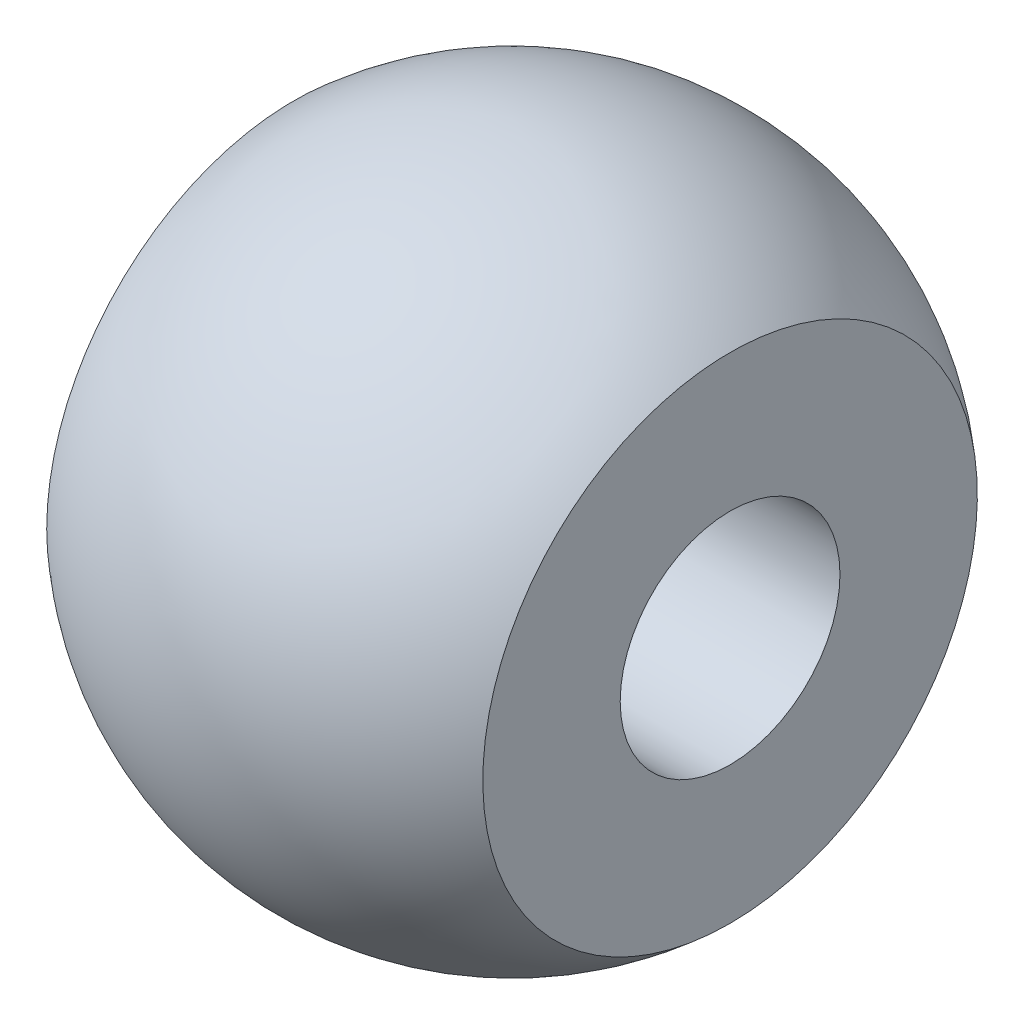
ISO-10303-21;
HEADER;
FILE_DESCRIPTION(('STEP AP214'),'2;1');
FILE_NAME('part.step','',(''),(''),'','','');
FILE_SCHEMA(('AUTOMOTIVE_DESIGN { 1 0 10303 214 1 1 1 1 }'));
ENDSEC;
DATA;
#1=APPLICATION_CONTEXT('core data for automotive mechanical design processes');
#2=APPLICATION_PROTOCOL_DEFINITION('international standard','automotive_design',2000,#1);
#3=PRODUCT_CONTEXT('',#1,'mechanical');
#4=PRODUCT('Part','Part','',(#3));
#5=PRODUCT_RELATED_PRODUCT_CATEGORY('part','',(#4));
#6=PRODUCT_DEFINITION_FORMATION('','',#4);
#7=PRODUCT_DEFINITION_CONTEXT('part definition',#1,'design');
#8=PRODUCT_DEFINITION('design','',#6,#7);
#9=PRODUCT_DEFINITION_SHAPE('','',#8);
#10=(LENGTH_UNIT() NAMED_UNIT(*) SI_UNIT(.MILLI.,.METRE.));
#11=(NAMED_UNIT(*) PLANE_ANGLE_UNIT() SI_UNIT($,.RADIAN.));
#12=(NAMED_UNIT(*) SI_UNIT($,.STERADIAN.) SOLID_ANGLE_UNIT());
#13=UNCERTAINTY_MEASURE_WITH_UNIT(LENGTH_MEASURE(1.E-05),#10,'distance_accuracy_value','');
#14=(GEOMETRIC_REPRESENTATION_CONTEXT(3) GLOBAL_UNCERTAINTY_ASSIGNED_CONTEXT((#13)) GLOBAL_UNIT_ASSIGNED_CONTEXT((#10,
#11,#12)) REPRESENTATION_CONTEXT('',''));
#15=CARTESIAN_POINT('',(0.,0.,0.));
#16=DIRECTION('',(0.,0.,1.));
#17=DIRECTION('',(1.,0.,0.));
#18=AXIS2_PLACEMENT_3D('',#15,#16,#17);
#19=CARTESIAN_POINT('',(-3.96862696659689,0.,0.));
#20=DIRECTION('',(-1.,0.,0.));
#21=DIRECTION('',(0.,0.,1.));
#22=AXIS2_PLACEMENT_3D('',#19,#20,#21);
#23=CONICAL_SURFACE('',#22,4.5,0.78539816339745);
#24=CARTESIAN_POINT('',(-1.4686269665969,0.,0.));
#25=DIRECTION('',(-1.,0.,0.));
#26=DIRECTION('',(0.,0.,1.));
#27=AXIS2_PLACEMENT_3D('',#24,#25,#26);
#28=CIRCLE('',#27,2.);
#29=CARTESIAN_POINT('',(-1.4686269665969,0.,2.));
#30=VERTEX_POINT('',#29);
#31=EDGE_CURVE('E48',#30,#30,#28,.T.);
#32=ORIENTED_EDGE('',*,*,#31,.F.);
#33=EDGE_LOOP('',(#32));
#34=FACE_BOUND('',#33,.T.);
#35=CARTESIAN_POINT('',(-3.96862696659689,0.,0.));
#36=DIRECTION('',(-1.,0.,0.));
#37=DIRECTION('',(0.,0.,1.));
#38=AXIS2_PLACEMENT_3D('',#35,#36,#37);
#39=CIRCLE('',#38,4.5);
#40=CARTESIAN_POINT('',(-3.96862696659689,-4.5,0.));
#41=VERTEX_POINT('',#40);
#42=EDGE_CURVE('E10',#41,#41,#39,.T.);
#43=ORIENTED_EDGE('',*,*,#42,.T.);
#44=EDGE_LOOP('',(#43));
#45=FACE_BOUND('',#44,.T.);
#46=ADVANCED_FACE('F34',(#34,#45),#23,.F.);
#47=CARTESIAN_POINT('',(0.,0.,0.));
#48=DIRECTION('',(-1.,0.,0.));
#49=DIRECTION('',(0.,-1.,0.));
#50=AXIS2_PLACEMENT_3D('',#47,#48,#49);
#51=SPHERICAL_SURFACE('',#50,6.);
#52=CARTESIAN_POINT('',(3.96862696659689,0.,0.));
#53=DIRECTION('',(-1.,0.,0.));
#54=DIRECTION('',(0.,0.,1.));
#55=AXIS2_PLACEMENT_3D('',#52,#53,#54);
#56=CIRCLE('',#55,4.5);
#57=CARTESIAN_POINT('',(3.96862696659689,-4.5,0.));
#58=VERTEX_POINT('',#57);
#59=EDGE_CURVE('E40',#58,#58,#56,.T.);
#60=CARTESIAN_POINT('',(3.96862696659689,-4.5,0.));
#61=CARTESIAN_POINT('',(3.90087156970494,-4.55975663481962,0.));
#62=CARTESIAN_POINT('',(3.83176471598761,-4.61798068485083,0.));
#63=CARTESIAN_POINT('',(3.69099319258735,-4.73124994921595,0.));
#64=CARTESIAN_POINT('',(3.61932852290442,-4.78629516354986,0.));
#65=CARTESIAN_POINT('',(3.47358646525808,-4.89309309039986,0.));
#66=CARTESIAN_POINT('',(3.39950907729467,-4.94484580291597,0.));
#67=CARTESIAN_POINT('',(3.24909300105526,-5.0449535145759,0.));
#68=CARTESIAN_POINT('',(3.17275431277925,-5.09330851371973,0.));
#69=CARTESIAN_POINT('',(3.01797129243332,-5.18652205302433,0.));
#70=CARTESIAN_POINT('',(2.93952696036339,-5.23138059318509,0.));
#71=CARTESIAN_POINT('',(2.78069270497835,-5.31750972666551,0.));
#72=CARTESIAN_POINT('',(2.70030278166326,-5.35878031998517,0.));
#73=CARTESIAN_POINT('',(2.5377413385661,-5.43764935813207,0.));
#74=CARTESIAN_POINT('',(2.45556981878404,-5.4752478029593,0.));
#75=CARTESIAN_POINT('',(2.28961281930654,-5.54669584283945,0.));
#76=CARTESIAN_POINT('',(2.2058273396111,-5.58054543789236,0.));
#77=CARTESIAN_POINT('',(2.03681334750818,-5.64442672242946,0.));
#78=CARTESIAN_POINT('',(1.95158483510071,-5.67445841191364,0.));
#79=CARTESIAN_POINT('',(1.77985864916938,-5.7306426189277,0.));
#80=CARTESIAN_POINT('',(1.69336097564551,-5.75679513645758,0.));
#81=CARTESIAN_POINT('',(1.51927292810631,-5.8051676467581,0.));
#82=CARTESIAN_POINT('',(1.43168255409096,-5.82738763952874,0.));
#83=CARTESIAN_POINT('',(1.25558779540806,-5.86784977014805,0.));
#84=CARTESIAN_POINT('',(1.16708341074051,-5.88609190799673,0.));
#85=CARTESIAN_POINT('',(0.989341185221306,-5.91856111366939,0.));
#86=CARTESIAN_POINT('',(0.90010334436966,-5.93278818149338,0.));
#87=CARTESIAN_POINT('',(0.721076257249468,-5.95719822301079,0.));
#88=CARTESIAN_POINT('',(0.631287010980921,-5.96738119670421,0.));
#89=CARTESIAN_POINT('',(0.451340288694878,-5.98368227605823,0.));
#90=CARTESIAN_POINT('',(0.361182812677381,-5.98980038171882,0.));
#91=CARTESIAN_POINT('',(0.180683557773256,-5.9979592436897,0.));
#92=CARTESIAN_POINT('',(0.0903417788866283,-6.,0.));
#93=CARTESIAN_POINT('',(-0.090341778886627,-6.,0.));
#94=CARTESIAN_POINT('',(-0.180683557773255,-5.9979592436897,0.));
#95=CARTESIAN_POINT('',(-0.361182812677379,-5.98980038171882,0.));
#96=CARTESIAN_POINT('',(-0.451340288694876,-5.98368227605823,0.));
#97=CARTESIAN_POINT('',(-0.63128701098092,-5.96738119670421,0.));
#98=CARTESIAN_POINT('',(-0.721076257249467,-5.95719822301079,0.));
#99=CARTESIAN_POINT('',(-0.900103344369659,-5.93278818149338,0.));
#100=CARTESIAN_POINT('',(-0.989341185221305,-5.91856111366939,0.));
#101=CARTESIAN_POINT('',(-1.1670834107405,-5.88609190799673,0.));
#102=CARTESIAN_POINT('',(-1.25558779540806,-5.86784977014805,0.));
#103=CARTESIAN_POINT('',(-1.43168255409096,-5.82738763952874,0.));
#104=CARTESIAN_POINT('',(-1.51927292810631,-5.8051676467581,0.));
#105=CARTESIAN_POINT('',(-1.69336097564551,-5.75679513645758,0.));
#106=CARTESIAN_POINT('',(-1.77985864916937,-5.7306426189277,0.));
#107=CARTESIAN_POINT('',(-1.95158483510071,-5.67445841191364,0.));
#108=CARTESIAN_POINT('',(-2.03681334750818,-5.64442672242946,0.));
#109=CARTESIAN_POINT('',(-2.2058273396111,-5.58054543789237,0.));
#110=CARTESIAN_POINT('',(-2.28961281930654,-5.54669584283945,0.));
#111=CARTESIAN_POINT('',(-2.45556981878404,-5.47524780295931,0.));
#112=CARTESIAN_POINT('',(-2.5377413385661,-5.43764935813207,0.));
#113=CARTESIAN_POINT('',(-2.70030278166325,-5.35878031998517,0.));
#114=CARTESIAN_POINT('',(-2.78069270497835,-5.31750972666551,0.));
#115=CARTESIAN_POINT('',(-2.93952696036338,-5.23138059318509,0.));
#116=CARTESIAN_POINT('',(-3.01797129243332,-5.18652205302433,0.));
#117=CARTESIAN_POINT('',(-3.17275431277925,-5.09330851371973,0.));
#118=CARTESIAN_POINT('',(-3.24909300105525,-5.0449535145759,0.));
#119=CARTESIAN_POINT('',(-3.39950907729467,-4.94484580291597,0.));
#120=CARTESIAN_POINT('',(-3.47358646525808,-4.89309309039986,0.));
#121=CARTESIAN_POINT('',(-3.61932852290442,-4.78629516354986,0.));
#122=CARTESIAN_POINT('',(-3.69099319258735,-4.73124994921595,0.));
#123=CARTESIAN_POINT('',(-3.83176471598761,-4.61798068485083,0.));
#124=CARTESIAN_POINT('',(-3.90087156970493,-4.55975663481962,0.));
#125=CARTESIAN_POINT('',(-3.96862696659689,-4.5,0.));
#126=B_SPLINE_CURVE_WITH_KNOTS('',3,(#60,#61,#62,#63,#64,#65,#66,#67,#68,#69,#70,#71,#72,#73,
#74,#75,#76,#77,#78,#79,#80,#81,#82,#83,#84,#85,#86,#87,#88,#89,#90,#91,#92,#93,#94,#95,#96,#97,
#98,#99,#100,#101,#102,#103,#104,#105,#106,#107,#108,#109,#110,#111,#112,#113,#114,#115,#116,
#117,#118,#119,#120,#121,#122,#123,#124,#125),.UNSPECIFIED.,.F.,.F.,(4,2,2,2,2,2,2,2,2,2,2,2,2,
2,2,2,2,2,2,2,2,2,2,2,2,2,2,2,2,2,2,2,4),(0.,0.27100230174091,0.542004603481821,
0.81300690522273,1.08400920696364,1.35501150870455,1.62601381044546,1.89701611218637,
2.16801841392728,2.43902071566819,2.7100230174091,2.98102531915001,3.25202762089092,
3.52302992263183,3.79403222437274,4.06503452611365,4.33603682785456,4.60703912959547,
4.87804143133638,5.14904373307729,5.4200460348182,5.69104833655911,5.96205063830002,
6.23305294004093,6.50405524178184,6.77505754352275,7.04605984526366,7.31706214700457,
7.58806444874548,7.85906675048639,8.1300690522273,8.40107135396821,8.67207365570912),.UNSPECIFIED.);
#127=EDGE_CURVE('BSEAM57',#58,#41,#126,.T.);
#128=ORIENTED_EDGE('',*,*,#59,.T.);
#129=ORIENTED_EDGE('',*,*,#42,.F.);
#130=ORIENTED_EDGE('',*,*,#127,.T.);
#131=ORIENTED_EDGE('',*,*,#127,.F.);
#132=EDGE_LOOP('',(#128,#130,#129,#131));
#133=FACE_BOUND('',#132,.T.);
#134=ADVANCED_FACE('F57',(#133),#51,.T.);
#135=CARTESIAN_POINT('',(3.96862696659689,0.,0.));
#136=DIRECTION('',(-1.,0.,0.));
#137=DIRECTION('',(0.,0.,1.));
#138=AXIS2_PLACEMENT_3D('',#135,#136,#137);
#139=PLANE('',#138);
#140=ORIENTED_EDGE('',*,*,#59,.F.);
#141=EDGE_LOOP('',(#140));
#142=FACE_BOUND('',#141,.T.);
#143=CARTESIAN_POINT('',(3.96862696659689,0.,0.));
#144=DIRECTION('',(-1.,0.,0.));
#145=DIRECTION('',(0.,0.,1.));
#146=AXIS2_PLACEMENT_3D('',#143,#144,#145);
#147=CIRCLE('',#146,2.);
#148=CARTESIAN_POINT('',(3.96862696659689,0.,2.));
#149=VERTEX_POINT('',#148);
#150=EDGE_CURVE('E44',#149,#149,#147,.T.);
#151=ORIENTED_EDGE('',*,*,#150,.T.);
#152=EDGE_LOOP('',(#151));
#153=FACE_BOUND('',#152,.T.);
#154=ADVANCED_FACE('F61',(#142,#153),#139,.F.);
#155=CARTESIAN_POINT('',(-10.3321307170917,0.,0.));
#156=DIRECTION('',(-1.,0.,0.));
#157=DIRECTION('',(0.,0.,1.));
#158=AXIS2_PLACEMENT_3D('',#155,#156,#157);
#159=CYLINDRICAL_SURFACE('',#158,2.);
#160=ORIENTED_EDGE('',*,*,#150,.F.);
#161=EDGE_LOOP('',(#160));
#162=FACE_BOUND('',#161,.T.);
#163=ORIENTED_EDGE('',*,*,#31,.T.);
#164=EDGE_LOOP('',(#163));
#165=FACE_BOUND('',#164,.T.);
#166=ADVANCED_FACE('F54',(#162,#165),#159,.F.);
#167=CLOSED_SHELL('',(#46,#134,#154,#166));
#168=MANIFOLD_SOLID_BREP('B2',#167);
#169=ADVANCED_BREP_SHAPE_REPRESENTATION('',(#18,#168),#14);
#170=SHAPE_DEFINITION_REPRESENTATION(#9,#169);
ENDSEC;
END-ISO-10303-21;
